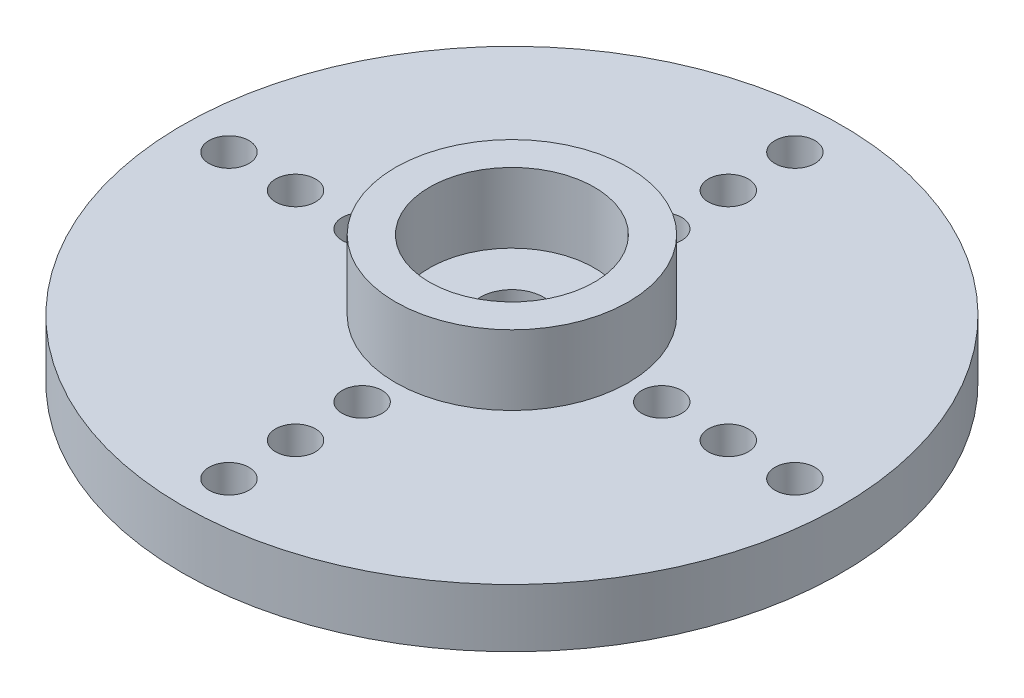
ISO-10303-21;
HEADER;
FILE_DESCRIPTION(('STEP AP214'),'2;1');
FILE_NAME('part.step','',(''),(''),'','','');
FILE_SCHEMA(('AUTOMOTIVE_DESIGN { 1 0 10303 214 1 1 1 1 }'));
ENDSEC;
DATA;
#1=APPLICATION_CONTEXT('core data for automotive mechanical design processes');
#2=APPLICATION_PROTOCOL_DEFINITION('international standard','automotive_design',2000,#1);
#3=PRODUCT_CONTEXT('',#1,'mechanical');
#4=PRODUCT('Part','Part','',(#3));
#5=PRODUCT_RELATED_PRODUCT_CATEGORY('part','',(#4));
#6=PRODUCT_DEFINITION_FORMATION('','',#4);
#7=PRODUCT_DEFINITION_CONTEXT('part definition',#1,'design');
#8=PRODUCT_DEFINITION('design','',#6,#7);
#9=PRODUCT_DEFINITION_SHAPE('','',#8);
#10=(LENGTH_UNIT() NAMED_UNIT(*) SI_UNIT(.MILLI.,.METRE.));
#11=(NAMED_UNIT(*) PLANE_ANGLE_UNIT() SI_UNIT($,.RADIAN.));
#12=(NAMED_UNIT(*) SI_UNIT($,.STERADIAN.) SOLID_ANGLE_UNIT());
#13=UNCERTAINTY_MEASURE_WITH_UNIT(LENGTH_MEASURE(1.E-05),#10,'distance_accuracy_value','');
#14=(GEOMETRIC_REPRESENTATION_CONTEXT(3) GLOBAL_UNCERTAINTY_ASSIGNED_CONTEXT((#13)) GLOBAL_UNIT_ASSIGNED_CONTEXT((#10,
#11,#12)) REPRESENTATION_CONTEXT('',''));
#15=CARTESIAN_POINT('',(0.,0.,0.));
#16=DIRECTION('',(0.,0.,1.));
#17=DIRECTION('',(1.,0.,0.));
#18=AXIS2_PLACEMENT_3D('',#15,#16,#17);
#19=CARTESIAN_POINT('',(0.,1.75,0.));
#20=DIRECTION('',(0.,-1.,0.));
#21=DIRECTION('',(0.,0.,-1.));
#22=AXIS2_PLACEMENT_3D('',#19,#20,#21);
#23=CYLINDRICAL_SURFACE('',#22,9.9);
#24=CARTESIAN_POINT('',(0.,1.75,0.));
#25=DIRECTION('',(0.,1.,0.));
#26=DIRECTION('',(0.,0.,1.));
#27=AXIS2_PLACEMENT_3D('',#24,#25,#26);
#28=CIRCLE('',#27,9.9);
#29=CARTESIAN_POINT('',(0.,1.75,9.9));
#30=VERTEX_POINT('',#29);
#31=EDGE_CURVE('E41',#30,#30,#28,.T.);
#32=ORIENTED_EDGE('',*,*,#31,.F.);
#33=EDGE_LOOP('',(#32));
#34=FACE_BOUND('',#33,.T.);
#35=CARTESIAN_POINT('',(0.,0.,0.));
#36=DIRECTION('',(0.,1.,0.));
#37=DIRECTION('',(0.,0.,1.));
#38=AXIS2_PLACEMENT_3D('',#35,#36,#37);
#39=CIRCLE('',#38,9.9);
#40=CARTESIAN_POINT('',(0.,0.,9.9));
#41=VERTEX_POINT('',#40);
#42=EDGE_CURVE('E44',#41,#41,#39,.T.);
#43=ORIENTED_EDGE('',*,*,#42,.T.);
#44=EDGE_LOOP('',(#43));
#45=FACE_BOUND('',#44,.T.);
#46=ADVANCED_FACE('F30',(#34,#45),#23,.T.);
#47=CARTESIAN_POINT('',(0.,1.75,0.));
#48=DIRECTION('',(0.,1.,0.));
#49=DIRECTION('',(0.,0.,1.));
#50=AXIS2_PLACEMENT_3D('',#47,#48,#49);
#51=PLANE('',#50);
#52=CARTESIAN_POINT('',(-6.5,1.75,0.));
#53=DIRECTION('',(0.,1.,0.));
#54=DIRECTION('',(-1.,0.,0.));
#55=AXIS2_PLACEMENT_3D('',#52,#53,#54);
#56=CIRCLE('',#55,0.6);
#57=CARTESIAN_POINT('',(-7.1,1.75,0.));
#58=VERTEX_POINT('',#57);
#59=EDGE_CURVE('E135',#58,#58,#56,.T.);
#60=ORIENTED_EDGE('',*,*,#59,.F.);
#61=EDGE_LOOP('',(#60));
#62=FACE_BOUND('',#61,.T.);
#63=CARTESIAN_POINT('',(0.,1.75,-6.5));
#64=DIRECTION('',(0.,1.,0.));
#65=DIRECTION('',(0.,0.,-1.));
#66=AXIS2_PLACEMENT_3D('',#63,#64,#65);
#67=CIRCLE('',#66,0.6);
#68=CARTESIAN_POINT('',(0.,1.75,-7.1));
#69=VERTEX_POINT('',#68);
#70=EDGE_CURVE('E128',#69,#69,#67,.T.);
#71=ORIENTED_EDGE('',*,*,#70,.F.);
#72=EDGE_LOOP('',(#71));
#73=FACE_BOUND('',#72,.T.);
#74=CARTESIAN_POINT('',(6.5,1.75,0.));
#75=DIRECTION('',(0.,1.,0.));
#76=DIRECTION('',(1.,0.,0.));
#77=AXIS2_PLACEMENT_3D('',#74,#75,#76);
#78=CIRCLE('',#77,0.6);
#79=CARTESIAN_POINT('',(7.1,1.75,0.));
#80=VERTEX_POINT('',#79);
#81=EDGE_CURVE('E129',#80,#80,#78,.T.);
#82=ORIENTED_EDGE('',*,*,#81,.F.);
#83=EDGE_LOOP('',(#82));
#84=FACE_BOUND('',#83,.T.);
#85=CARTESIAN_POINT('',(-8.5,1.75,0.));
#86=DIRECTION('',(0.,1.,0.));
#87=DIRECTION('',(-1.,0.,0.));
#88=AXIS2_PLACEMENT_3D('',#85,#86,#87);
#89=CIRCLE('',#88,0.6);
#90=CARTESIAN_POINT('',(-9.1,1.75,0.));
#91=VERTEX_POINT('',#90);
#92=EDGE_CURVE('E118',#91,#91,#89,.T.);
#93=ORIENTED_EDGE('',*,*,#92,.F.);
#94=EDGE_LOOP('',(#93));
#95=FACE_BOUND('',#94,.T.);
#96=CARTESIAN_POINT('',(0.,1.75,-8.5));
#97=DIRECTION('',(0.,1.,0.));
#98=DIRECTION('',(0.,0.,-1.));
#99=AXIS2_PLACEMENT_3D('',#96,#97,#98);
#100=CIRCLE('',#99,0.6);
#101=CARTESIAN_POINT('',(0.,1.75,-9.1));
#102=VERTEX_POINT('',#101);
#103=EDGE_CURVE('E110',#102,#102,#100,.T.);
#104=ORIENTED_EDGE('',*,*,#103,.F.);
#105=EDGE_LOOP('',(#104));
#106=FACE_BOUND('',#105,.T.);
#107=CARTESIAN_POINT('',(8.5,1.75,0.));
#108=DIRECTION('',(0.,1.,0.));
#109=DIRECTION('',(1.,0.,0.));
#110=AXIS2_PLACEMENT_3D('',#107,#108,#109);
#111=CIRCLE('',#110,0.6);
#112=CARTESIAN_POINT('',(9.1,1.75,0.));
#113=VERTEX_POINT('',#112);
#114=EDGE_CURVE('E111',#113,#113,#111,.T.);
#115=ORIENTED_EDGE('',*,*,#114,.F.);
#116=EDGE_LOOP('',(#115));
#117=FACE_BOUND('',#116,.T.);
#118=CARTESIAN_POINT('',(-4.5,1.75,0.));
#119=DIRECTION('',(0.,1.,0.));
#120=DIRECTION('',(-1.,0.,0.));
#121=AXIS2_PLACEMENT_3D('',#118,#119,#120);
#122=CIRCLE('',#121,0.6);
#123=CARTESIAN_POINT('',(-5.1,1.75,0.));
#124=VERTEX_POINT('',#123);
#125=EDGE_CURVE('E100',#124,#124,#122,.T.);
#126=ORIENTED_EDGE('',*,*,#125,.F.);
#127=EDGE_LOOP('',(#126));
#128=FACE_BOUND('',#127,.T.);
#129=CARTESIAN_POINT('',(0.,1.75,-4.5));
#130=DIRECTION('',(0.,1.,0.));
#131=DIRECTION('',(0.,0.,-1.));
#132=AXIS2_PLACEMENT_3D('',#129,#130,#131);
#133=CIRCLE('',#132,0.6);
#134=CARTESIAN_POINT('',(0.,1.75,-5.1));
#135=VERTEX_POINT('',#134);
#136=EDGE_CURVE('E92',#135,#135,#133,.T.);
#137=ORIENTED_EDGE('',*,*,#136,.F.);
#138=EDGE_LOOP('',(#137));
#139=FACE_BOUND('',#138,.T.);
#140=CARTESIAN_POINT('',(4.5,1.75,0.));
#141=DIRECTION('',(0.,1.,0.));
#142=DIRECTION('',(1.,0.,0.));
#143=AXIS2_PLACEMENT_3D('',#140,#141,#142);
#144=CIRCLE('',#143,0.6);
#145=CARTESIAN_POINT('',(5.1,1.75,0.));
#146=VERTEX_POINT('',#145);
#147=EDGE_CURVE('E93',#146,#146,#144,.T.);
#148=ORIENTED_EDGE('',*,*,#147,.F.);
#149=EDGE_LOOP('',(#148));
#150=FACE_BOUND('',#149,.T.);
#151=CARTESIAN_POINT('',(0.,1.75,4.5));
#152=DIRECTION('',(0.,1.,0.));
#153=DIRECTION('',(0.,0.,1.));
#154=AXIS2_PLACEMENT_3D('',#151,#152,#153);
#155=CIRCLE('',#154,0.6);
#156=CARTESIAN_POINT('',(0.,1.75,5.1));
#157=VERTEX_POINT('',#156);
#158=EDGE_CURVE('E70',#157,#157,#155,.T.);
#159=ORIENTED_EDGE('',*,*,#158,.F.);
#160=EDGE_LOOP('',(#159));
#161=FACE_BOUND('',#160,.T.);
#162=CARTESIAN_POINT('',(0.,1.75,6.5));
#163=DIRECTION('',(0.,1.,0.));
#164=DIRECTION('',(0.,0.,1.));
#165=AXIS2_PLACEMENT_3D('',#162,#163,#164);
#166=CIRCLE('',#165,0.6);
#167=CARTESIAN_POINT('',(0.,1.75,7.1));
#168=VERTEX_POINT('',#167);
#169=EDGE_CURVE('E73',#168,#168,#166,.T.);
#170=ORIENTED_EDGE('',*,*,#169,.F.);
#171=EDGE_LOOP('',(#170));
#172=FACE_BOUND('',#171,.T.);
#173=CARTESIAN_POINT('',(0.,1.75,8.5));
#174=DIRECTION('',(0.,1.,0.));
#175=DIRECTION('',(0.,0.,1.));
#176=AXIS2_PLACEMENT_3D('',#173,#174,#175);
#177=CIRCLE('',#176,0.6);
#178=CARTESIAN_POINT('',(0.,1.75,9.1));
#179=VERTEX_POINT('',#178);
#180=EDGE_CURVE('E76',#179,#179,#177,.T.);
#181=ORIENTED_EDGE('',*,*,#180,.F.);
#182=EDGE_LOOP('',(#181));
#183=FACE_BOUND('',#182,.T.);
#184=CARTESIAN_POINT('',(0.,1.75,0.));
#185=DIRECTION('',(0.,1.,0.));
#186=DIRECTION('',(0.,0.,1.));
#187=AXIS2_PLACEMENT_3D('',#184,#185,#186);
#188=CIRCLE('',#187,3.5);
#189=CARTESIAN_POINT('',(0.,1.75,3.5));
#190=VERTEX_POINT('',#189);
#191=EDGE_CURVE('E50',#190,#190,#188,.T.);
#192=ORIENTED_EDGE('',*,*,#191,.F.);
#193=EDGE_LOOP('',(#192));
#194=FACE_BOUND('',#193,.T.);
#195=ORIENTED_EDGE('',*,*,#31,.T.);
#196=EDGE_LOOP('',(#195));
#197=FACE_BOUND('',#196,.T.);
#198=ADVANCED_FACE('F146',(#62,#73,#84,#95,#106,#117,#128,#139,#150,#161,#172,#183,#194,#197),
#51,.T.);
#199=CARTESIAN_POINT('',(0.,0.,0.));
#200=DIRECTION('',(0.,1.,0.));
#201=DIRECTION('',(0.,0.,1.));
#202=AXIS2_PLACEMENT_3D('',#199,#200,#201);
#203=PLANE('',#202);
#204=CARTESIAN_POINT('',(-6.5,0.,0.));
#205=DIRECTION('',(0.,-1.,0.));
#206=DIRECTION('',(1.,0.,0.));
#207=AXIS2_PLACEMENT_3D('',#204,#205,#206);
#208=CIRCLE('',#207,0.6);
#209=CARTESIAN_POINT('',(-5.9,0.,0.));
#210=VERTEX_POINT('',#209);
#211=EDGE_CURVE('E114',#210,#210,#208,.T.);
#212=ORIENTED_EDGE('',*,*,#211,.F.);
#213=EDGE_LOOP('',(#212));
#214=FACE_BOUND('',#213,.T.);
#215=CARTESIAN_POINT('',(0.,0.,-6.5));
#216=DIRECTION('',(0.,-1.,0.));
#217=DIRECTION('',(0.,0.,1.));
#218=AXIS2_PLACEMENT_3D('',#215,#216,#217);
#219=CIRCLE('',#218,0.6);
#220=CARTESIAN_POINT('',(0.,0.,-5.9));
#221=VERTEX_POINT('',#220);
#222=EDGE_CURVE('E132',#221,#221,#219,.T.);
#223=ORIENTED_EDGE('',*,*,#222,.F.);
#224=EDGE_LOOP('',(#223));
#225=FACE_BOUND('',#224,.T.);
#226=CARTESIAN_POINT('',(6.5,0.,0.));
#227=DIRECTION('',(0.,-1.,0.));
#228=DIRECTION('',(-1.,0.,0.));
#229=AXIS2_PLACEMENT_3D('',#226,#227,#228);
#230=CIRCLE('',#229,0.6);
#231=CARTESIAN_POINT('',(5.9,0.,0.));
#232=VERTEX_POINT('',#231);
#233=EDGE_CURVE('E125',#232,#232,#230,.T.);
#234=ORIENTED_EDGE('',*,*,#233,.F.);
#235=EDGE_LOOP('',(#234));
#236=FACE_BOUND('',#235,.T.);
#237=CARTESIAN_POINT('',(-8.5,0.,0.));
#238=DIRECTION('',(0.,-1.,0.));
#239=DIRECTION('',(1.,0.,0.));
#240=AXIS2_PLACEMENT_3D('',#237,#238,#239);
#241=CIRCLE('',#240,0.6);
#242=CARTESIAN_POINT('',(-7.9,0.,0.));
#243=VERTEX_POINT('',#242);
#244=EDGE_CURVE('E96',#243,#243,#241,.T.);
#245=ORIENTED_EDGE('',*,*,#244,.F.);
#246=EDGE_LOOP('',(#245));
#247=FACE_BOUND('',#246,.T.);
#248=CARTESIAN_POINT('',(0.,0.,-8.5));
#249=DIRECTION('',(0.,-1.,0.));
#250=DIRECTION('',(0.,0.,1.));
#251=AXIS2_PLACEMENT_3D('',#248,#249,#250);
#252=CIRCLE('',#251,0.6);
#253=CARTESIAN_POINT('',(0.,0.,-7.9));
#254=VERTEX_POINT('',#253);
#255=EDGE_CURVE('E115',#254,#254,#252,.T.);
#256=ORIENTED_EDGE('',*,*,#255,.F.);
#257=EDGE_LOOP('',(#256));
#258=FACE_BOUND('',#257,.T.);
#259=CARTESIAN_POINT('',(8.5,0.,0.));
#260=DIRECTION('',(0.,-1.,0.));
#261=DIRECTION('',(-1.,0.,0.));
#262=AXIS2_PLACEMENT_3D('',#259,#260,#261);
#263=CIRCLE('',#262,0.6);
#264=CARTESIAN_POINT('',(7.9,0.,0.));
#265=VERTEX_POINT('',#264);
#266=EDGE_CURVE('E107',#265,#265,#263,.T.);
#267=ORIENTED_EDGE('',*,*,#266,.F.);
#268=EDGE_LOOP('',(#267));
#269=FACE_BOUND('',#268,.T.);
#270=CARTESIAN_POINT('',(-4.5,0.,0.));
#271=DIRECTION('',(0.,-1.,0.));
#272=DIRECTION('',(1.,0.,0.));
#273=AXIS2_PLACEMENT_3D('',#270,#271,#272);
#274=CIRCLE('',#273,0.6);
#275=CARTESIAN_POINT('',(-3.9,0.,0.));
#276=VERTEX_POINT('',#275);
#277=EDGE_CURVE('E84',#276,#276,#274,.T.);
#278=ORIENTED_EDGE('',*,*,#277,.F.);
#279=EDGE_LOOP('',(#278));
#280=FACE_BOUND('',#279,.T.);
#281=CARTESIAN_POINT('',(0.,0.,-4.5));
#282=DIRECTION('',(0.,-1.,0.));
#283=DIRECTION('',(0.,0.,1.));
#284=AXIS2_PLACEMENT_3D('',#281,#282,#283);
#285=CIRCLE('',#284,0.6);
#286=CARTESIAN_POINT('',(0.,0.,-3.9));
#287=VERTEX_POINT('',#286);
#288=EDGE_CURVE('E97',#287,#287,#285,.T.);
#289=ORIENTED_EDGE('',*,*,#288,.F.);
#290=EDGE_LOOP('',(#289));
#291=FACE_BOUND('',#290,.T.);
#292=CARTESIAN_POINT('',(4.5,0.,0.));
#293=DIRECTION('',(0.,-1.,0.));
#294=DIRECTION('',(-1.,0.,0.));
#295=AXIS2_PLACEMENT_3D('',#292,#293,#294);
#296=CIRCLE('',#295,0.6);
#297=CARTESIAN_POINT('',(3.9,0.,0.));
#298=VERTEX_POINT('',#297);
#299=EDGE_CURVE('E89',#298,#298,#296,.T.);
#300=ORIENTED_EDGE('',*,*,#299,.F.);
#301=EDGE_LOOP('',(#300));
#302=FACE_BOUND('',#301,.T.);
#303=CARTESIAN_POINT('',(0.,0.,4.5));
#304=DIRECTION('',(0.,-1.,0.));
#305=DIRECTION('',(0.,0.,-1.));
#306=AXIS2_PLACEMENT_3D('',#303,#304,#305);
#307=CIRCLE('',#306,0.6);
#308=CARTESIAN_POINT('',(0.,0.,3.9));
#309=VERTEX_POINT('',#308);
#310=EDGE_CURVE('E79',#309,#309,#307,.T.);
#311=ORIENTED_EDGE('',*,*,#310,.F.);
#312=EDGE_LOOP('',(#311));
#313=FACE_BOUND('',#312,.T.);
#314=CARTESIAN_POINT('',(0.,0.,6.5));
#315=DIRECTION('',(0.,-1.,0.));
#316=DIRECTION('',(0.,0.,-1.));
#317=AXIS2_PLACEMENT_3D('',#314,#315,#316);
#318=CIRCLE('',#317,0.6);
#319=CARTESIAN_POINT('',(0.,0.,5.9));
#320=VERTEX_POINT('',#319);
#321=EDGE_CURVE('E83',#320,#320,#318,.T.);
#322=ORIENTED_EDGE('',*,*,#321,.F.);
#323=EDGE_LOOP('',(#322));
#324=FACE_BOUND('',#323,.T.);
#325=CARTESIAN_POINT('',(0.,0.,8.5));
#326=DIRECTION('',(0.,-1.,0.));
#327=DIRECTION('',(0.,0.,-1.));
#328=AXIS2_PLACEMENT_3D('',#325,#326,#327);
#329=CIRCLE('',#328,0.6);
#330=CARTESIAN_POINT('',(0.,0.,7.9));
#331=VERTEX_POINT('',#330);
#332=EDGE_CURVE('E80',#331,#331,#329,.T.);
#333=ORIENTED_EDGE('',*,*,#332,.F.);
#334=EDGE_LOOP('',(#333));
#335=FACE_BOUND('',#334,.T.);
#336=CARTESIAN_POINT('',(0.,0.,0.));
#337=DIRECTION('',(0.,1.,0.));
#338=DIRECTION('',(0.,0.,1.));
#339=AXIS2_PLACEMENT_3D('',#336,#337,#338);
#340=CIRCLE('',#339,2.725);
#341=CARTESIAN_POINT('',(0.,0.,2.725));
#342=VERTEX_POINT('',#341);
#343=EDGE_CURVE('E10',#342,#342,#340,.F.);
#344=ORIENTED_EDGE('',*,*,#343,.F.);
#345=EDGE_LOOP('',(#344));
#346=FACE_BOUND('',#345,.T.);
#347=ORIENTED_EDGE('',*,*,#42,.F.);
#348=EDGE_LOOP('',(#347));
#349=FACE_BOUND('',#348,.T.);
#350=ADVANCED_FACE('F149',(#214,#225,#236,#247,#258,#269,#280,#291,#302,#313,#324,#335,#346,
#349),#203,.F.);
#351=CARTESIAN_POINT('',(0.,3.85,0.));
#352=DIRECTION('',(0.,1.,0.));
#353=DIRECTION('',(0.,0.,1.));
#354=AXIS2_PLACEMENT_3D('',#351,#352,#353);
#355=PLANE('',#354);
#356=CARTESIAN_POINT('',(0.,3.85,0.));
#357=DIRECTION('',(0.,1.,0.));
#358=DIRECTION('',(0.,0.,1.));
#359=AXIS2_PLACEMENT_3D('',#356,#357,#358);
#360=CIRCLE('',#359,3.5);
#361=CARTESIAN_POINT('',(0.,3.85,3.5));
#362=VERTEX_POINT('',#361);
#363=EDGE_CURVE('E47',#362,#362,#360,.T.);
#364=ORIENTED_EDGE('',*,*,#363,.T.);
#365=EDGE_LOOP('',(#364));
#366=FACE_BOUND('',#365,.T.);
#367=CARTESIAN_POINT('',(0.,3.85,0.));
#368=DIRECTION('',(0.,1.,0.));
#369=DIRECTION('',(0.,0.,1.));
#370=AXIS2_PLACEMENT_3D('',#367,#368,#369);
#371=CIRCLE('',#370,2.475);
#372=CARTESIAN_POINT('',(0.,3.85,2.475));
#373=VERTEX_POINT('',#372);
#374=EDGE_CURVE('E53',#373,#373,#371,.T.);
#375=ORIENTED_EDGE('',*,*,#374,.F.);
#376=EDGE_LOOP('',(#375));
#377=FACE_BOUND('',#376,.T.);
#378=ADVANCED_FACE('F183',(#366,#377),#355,.T.);
#379=CARTESIAN_POINT('',(0.,3.85,0.));
#380=DIRECTION('',(0.,-1.,0.));
#381=DIRECTION('',(0.,0.,-1.));
#382=AXIS2_PLACEMENT_3D('',#379,#380,#381);
#383=CYLINDRICAL_SURFACE('',#382,3.5);
#384=ORIENTED_EDGE('',*,*,#363,.F.);
#385=EDGE_LOOP('',(#384));
#386=FACE_BOUND('',#385,.T.);
#387=ORIENTED_EDGE('',*,*,#191,.T.);
#388=EDGE_LOOP('',(#387));
#389=FACE_BOUND('',#388,.T.);
#390=ADVANCED_FACE('F189',(#386,#389),#383,.T.);
#391=CARTESIAN_POINT('',(0.,3.85,0.));
#392=DIRECTION('',(0.,-1.,0.));
#393=DIRECTION('',(0.,0.,-1.));
#394=AXIS2_PLACEMENT_3D('',#391,#392,#393);
#395=CYLINDRICAL_SURFACE('',#394,2.475);
#396=ORIENTED_EDGE('',*,*,#374,.T.);
#397=EDGE_LOOP('',(#396));
#398=FACE_BOUND('',#397,.T.);
#399=CARTESIAN_POINT('',(0.,1.75,0.));
#400=DIRECTION('',(0.,1.,0.));
#401=DIRECTION('',(0.,0.,1.));
#402=AXIS2_PLACEMENT_3D('',#399,#400,#401);
#403=CIRCLE('',#402,2.475);
#404=CARTESIAN_POINT('',(0.,1.75,2.475));
#405=VERTEX_POINT('',#404);
#406=EDGE_CURVE('E37',#405,#405,#403,.F.);
#407=ORIENTED_EDGE('',*,*,#406,.T.);
#408=EDGE_LOOP('',(#407));
#409=FACE_BOUND('',#408,.T.);
#410=ADVANCED_FACE('F224',(#398,#409),#395,.F.);
#411=CARTESIAN_POINT('',(0.,1.75,0.));
#412=DIRECTION('',(0.,1.,0.));
#413=DIRECTION('',(0.,0.,1.));
#414=AXIS2_PLACEMENT_3D('',#411,#412,#413);
#415=CIRCLE('',#414,0.95);
#416=CARTESIAN_POINT('',(0.,1.75,-0.95));
#417=VERTEX_POINT('',#416);
#418=EDGE_CURVE('E33',#417,#417,#415,.T.);
#419=ORIENTED_EDGE('',*,*,#418,.F.);
#420=EDGE_LOOP('',(#419));
#421=FACE_BOUND('',#420,.T.);
#422=ORIENTED_EDGE('',*,*,#406,.F.);
#423=EDGE_LOOP('',(#422));
#424=FACE_BOUND('',#423,.T.);
#425=ADVANCED_FACE('F151',(#421,#424),#51,.T.);
#426=CARTESIAN_POINT('',(0.,-0.3,0.));
#427=DIRECTION('',(0.,-1.,0.));
#428=DIRECTION('',(0.,0.,-1.));
#429=AXIS2_PLACEMENT_3D('',#426,#427,#428);
#430=PLANE('',#429);
#431=CARTESIAN_POINT('',(0.,-0.3,0.));
#432=DIRECTION('',(0.,-1.,0.));
#433=DIRECTION('',(0.,0.,-1.));
#434=AXIS2_PLACEMENT_3D('',#431,#432,#433);
#435=CIRCLE('',#434,2.725);
#436=CARTESIAN_POINT('',(0.,-0.3,-2.725));
#437=VERTEX_POINT('',#436);
#438=EDGE_CURVE('E58',#437,#437,#435,.T.);
#439=ORIENTED_EDGE('',*,*,#438,.T.);
#440=EDGE_LOOP('',(#439));
#441=FACE_BOUND('',#440,.T.);
#442=CARTESIAN_POINT('',(0.,-0.3,0.));
#443=DIRECTION('',(0.,-1.,0.));
#444=DIRECTION('',(0.,0.,-1.));
#445=AXIS2_PLACEMENT_3D('',#442,#443,#444);
#446=CIRCLE('',#445,2.225);
#447=CARTESIAN_POINT('',(0.,-0.3,-2.225));
#448=VERTEX_POINT('',#447);
#449=EDGE_CURVE('E61',#448,#448,#446,.T.);
#450=ORIENTED_EDGE('',*,*,#449,.F.);
#451=EDGE_LOOP('',(#450));
#452=FACE_BOUND('',#451,.T.);
#453=ADVANCED_FACE('F216',(#441,#452),#430,.T.);
#454=CARTESIAN_POINT('',(0.,-0.3,0.));
#455=DIRECTION('',(0.,1.,0.));
#456=DIRECTION('',(0.,0.,1.));
#457=AXIS2_PLACEMENT_3D('',#454,#455,#456);
#458=CYLINDRICAL_SURFACE('',#457,2.725);
#459=ORIENTED_EDGE('',*,*,#438,.F.);
#460=EDGE_LOOP('',(#459));
#461=FACE_BOUND('',#460,.T.);
#462=ORIENTED_EDGE('',*,*,#343,.T.);
#463=EDGE_LOOP('',(#462));
#464=FACE_BOUND('',#463,.T.);
#465=ADVANCED_FACE('F205',(#461,#464),#458,.T.);
#466=CARTESIAN_POINT('',(0.,-0.3,0.));
#467=DIRECTION('',(0.,1.,0.));
#468=DIRECTION('',(0.,0.,1.));
#469=AXIS2_PLACEMENT_3D('',#466,#467,#468);
#470=CYLINDRICAL_SURFACE('',#469,2.225);
#471=ORIENTED_EDGE('',*,*,#449,.T.);
#472=EDGE_LOOP('',(#471));
#473=FACE_BOUND('',#472,.T.);
#474=CARTESIAN_POINT('',(0.,0.,0.));
#475=DIRECTION('',(0.,-1.,0.));
#476=DIRECTION('',(0.,0.,-1.));
#477=AXIS2_PLACEMENT_3D('',#474,#475,#476);
#478=CIRCLE('',#477,2.225);
#479=CARTESIAN_POINT('',(0.,0.,-2.225));
#480=VERTEX_POINT('',#479);
#481=EDGE_CURVE('E62',#480,#480,#478,.T.);
#482=ORIENTED_EDGE('',*,*,#481,.F.);
#483=EDGE_LOOP('',(#482));
#484=FACE_BOUND('',#483,.T.);
#485=ADVANCED_FACE('F196',(#473,#484),#470,.F.);
#486=CARTESIAN_POINT('',(0.,0.,0.));
#487=DIRECTION('',(0.,-1.,0.));
#488=DIRECTION('',(0.,0.,-1.));
#489=AXIS2_PLACEMENT_3D('',#486,#487,#488);
#490=CIRCLE('',#489,0.95);
#491=CARTESIAN_POINT('',(0.,0.,-0.95));
#492=VERTEX_POINT('',#491);
#493=EDGE_CURVE('E67',#492,#492,#490,.T.);
#494=ORIENTED_EDGE('',*,*,#493,.F.);
#495=EDGE_LOOP('',(#494));
#496=FACE_BOUND('',#495,.T.);
#497=ORIENTED_EDGE('',*,*,#481,.T.);
#498=EDGE_LOOP('',(#497));
#499=FACE_BOUND('',#498,.T.);
#500=ADVANCED_FACE('F185',(#496,#499),#203,.F.);
#501=CARTESIAN_POINT('',(0.,3.85,0.));
#502=DIRECTION('',(0.,-1.,0.));
#503=DIRECTION('',(0.,0.,-1.));
#504=AXIS2_PLACEMENT_3D('',#501,#502,#503);
#505=CYLINDRICAL_SURFACE('',#504,0.95);
#506=CARTESIAN_POINT('',(0.,1.75,-0.95));
#507=CARTESIAN_POINT('',(0.,1.73177083333333,-0.95));
#508=CARTESIAN_POINT('',(0.,1.71354166666667,-0.95));
#509=CARTESIAN_POINT('',(0.,1.67708333333333,-0.95));
#510=CARTESIAN_POINT('',(0.,1.65885416666667,-0.95));
#511=CARTESIAN_POINT('',(0.,1.62239583333333,-0.95));
#512=CARTESIAN_POINT('',(0.,1.60416666666667,-0.95));
#513=CARTESIAN_POINT('',(0.,1.56770833333333,-0.95));
#514=CARTESIAN_POINT('',(0.,1.54947916666667,-0.95));
#515=CARTESIAN_POINT('',(0.,1.51302083333333,-0.95));
#516=CARTESIAN_POINT('',(0.,1.49479166666667,-0.95));
#517=CARTESIAN_POINT('',(0.,1.45833333333333,-0.95));
#518=CARTESIAN_POINT('',(0.,1.44010416666667,-0.95));
#519=CARTESIAN_POINT('',(0.,1.40364583333333,-0.95));
#520=CARTESIAN_POINT('',(0.,1.38541666666667,-0.95));
#521=CARTESIAN_POINT('',(0.,1.34895833333333,-0.95));
#522=CARTESIAN_POINT('',(0.,1.33072916666667,-0.95));
#523=CARTESIAN_POINT('',(0.,1.29427083333333,-0.95));
#524=CARTESIAN_POINT('',(0.,1.27604166666667,-0.95));
#525=CARTESIAN_POINT('',(0.,1.23958333333333,-0.95));
#526=CARTESIAN_POINT('',(0.,1.22135416666667,-0.95));
#527=CARTESIAN_POINT('',(0.,1.18489583333333,-0.95));
#528=CARTESIAN_POINT('',(0.,1.16666666666667,-0.95));
#529=CARTESIAN_POINT('',(0.,1.13020833333333,-0.95));
#530=CARTESIAN_POINT('',(0.,1.11197916666667,-0.95));
#531=CARTESIAN_POINT('',(0.,1.07552083333333,-0.95));
#532=CARTESIAN_POINT('',(0.,1.05729166666667,-0.95));
#533=CARTESIAN_POINT('',(0.,1.02083333333333,-0.95));
#534=CARTESIAN_POINT('',(0.,1.00260416666667,-0.95));
#535=CARTESIAN_POINT('',(0.,0.966145833333333,-0.95));
#536=CARTESIAN_POINT('',(0.,0.947916666666666,-0.95));
#537=CARTESIAN_POINT('',(0.,0.911458333333333,-0.95));
#538=CARTESIAN_POINT('',(0.,0.893229166666667,-0.95));
#539=CARTESIAN_POINT('',(0.,0.856770833333333,-0.95));
#540=CARTESIAN_POINT('',(0.,0.838541666666667,-0.95));
#541=CARTESIAN_POINT('',(0.,0.802083333333333,-0.95));
#542=CARTESIAN_POINT('',(0.,0.783854166666667,-0.95));
#543=CARTESIAN_POINT('',(0.,0.747395833333333,-0.95));
#544=CARTESIAN_POINT('',(0.,0.729166666666667,-0.95));
#545=CARTESIAN_POINT('',(0.,0.692708333333333,-0.95));
#546=CARTESIAN_POINT('',(0.,0.674479166666667,-0.95));
#547=CARTESIAN_POINT('',(0.,0.638020833333333,-0.95));
#548=CARTESIAN_POINT('',(0.,0.619791666666667,-0.95));
#549=CARTESIAN_POINT('',(0.,0.583333333333333,-0.95));
#550=CARTESIAN_POINT('',(0.,0.565104166666667,-0.95));
#551=CARTESIAN_POINT('',(0.,0.528645833333333,-0.95));
#552=CARTESIAN_POINT('',(0.,0.510416666666667,-0.95));
#553=CARTESIAN_POINT('',(0.,0.473958333333333,-0.95));
#554=CARTESIAN_POINT('',(0.,0.455729166666667,-0.95));
#555=CARTESIAN_POINT('',(0.,0.419270833333333,-0.95));
#556=CARTESIAN_POINT('',(0.,0.401041666666667,-0.95));
#557=CARTESIAN_POINT('',(0.,0.364583333333333,-0.95));
#558=CARTESIAN_POINT('',(0.,0.346354166666667,-0.95));
#559=CARTESIAN_POINT('',(0.,0.309895833333334,-0.95));
#560=CARTESIAN_POINT('',(0.,0.291666666666667,-0.95));
#561=CARTESIAN_POINT('',(0.,0.255208333333334,-0.95));
#562=CARTESIAN_POINT('',(0.,0.236979166666667,-0.95));
#563=CARTESIAN_POINT('',(0.,0.200520833333334,-0.95));
#564=CARTESIAN_POINT('',(0.,0.182291666666667,-0.95));
#565=CARTESIAN_POINT('',(0.,0.145833333333334,-0.95));
#566=CARTESIAN_POINT('',(0.,0.127604166666667,-0.95));
#567=CARTESIAN_POINT('',(0.,0.0911458333333339,-0.95));
#568=CARTESIAN_POINT('',(0.,0.0729166666666672,-0.95));
#569=CARTESIAN_POINT('',(0.,0.0364583333333338,-0.95));
#570=CARTESIAN_POINT('',(0.,0.0182291666666671,-0.95));
#571=CARTESIAN_POINT('',(0.,0.,-0.95));
#572=B_SPLINE_CURVE_WITH_KNOTS('',3,(#506,#507,#508,#509,#510,#511,#512,#513,#514,#515,#516,
#517,#518,#519,#520,#521,#522,#523,#524,#525,#526,#527,#528,#529,#530,#531,#532,#533,#534,#535,
#536,#537,#538,#539,#540,#541,#542,#543,#544,#545,#546,#547,#548,#549,#550,#551,#552,#553,#554,
#555,#556,#557,#558,#559,#560,#561,#562,#563,#564,#565,#566,#567,#568,#569,#570,#571),
.UNSPECIFIED.,.F.,.F.,(4,2,2,2,2,2,2,2,2,2,2,2,2,2,2,2,2,2,2,2,2,2,2,2,2,2,2,2,2,2,2,2,4),(0.,
0.0546875,0.109375,0.1640625,0.21875,0.2734375,0.328125,0.3828125,0.4375,0.4921875,0.546875,
0.6015625,0.65625,0.7109375,0.765625,0.820312499999999,0.874999999999999,0.9296875,
0.984374999999999,1.0390625,1.09375,1.1484375,1.203125,1.2578125,1.3125,1.3671875,1.421875,
1.4765625,1.53125,1.5859375,1.640625,1.6953125,1.75),.UNSPECIFIED.);
#573=EDGE_CURVE('BSEAM195',#417,#492,#572,.T.);
#574=ORIENTED_EDGE('',*,*,#418,.T.);
#575=ORIENTED_EDGE('',*,*,#493,.T.);
#576=ORIENTED_EDGE('',*,*,#573,.T.);
#577=ORIENTED_EDGE('',*,*,#573,.F.);
#578=EDGE_LOOP('',(#574,#576,#575,#577));
#579=FACE_BOUND('',#578,.T.);
#580=ADVANCED_FACE('F195',(#579),#505,.F.);
#581=CARTESIAN_POINT('',(0.,3.85,8.5));
#582=DIRECTION('',(0.,-1.,0.));
#583=DIRECTION('',(0.,0.,-1.));
#584=AXIS2_PLACEMENT_3D('',#581,#582,#583);
#585=CYLINDRICAL_SURFACE('',#584,0.6);
#586=ORIENTED_EDGE('',*,*,#180,.T.);
#587=EDGE_LOOP('',(#586));
#588=FACE_BOUND('',#587,.T.);
#589=ORIENTED_EDGE('',*,*,#332,.T.);
#590=EDGE_LOOP('',(#589));
#591=FACE_BOUND('',#590,.T.);
#592=ADVANCED_FACE('F202',(#588,#591),#585,.F.);
#593=CARTESIAN_POINT('',(0.,3.85,6.5));
#594=DIRECTION('',(0.,-1.,0.));
#595=DIRECTION('',(0.,0.,-1.));
#596=AXIS2_PLACEMENT_3D('',#593,#594,#595);
#597=CYLINDRICAL_SURFACE('',#596,0.6);
#598=ORIENTED_EDGE('',*,*,#169,.T.);
#599=EDGE_LOOP('',(#598));
#600=FACE_BOUND('',#599,.T.);
#601=ORIENTED_EDGE('',*,*,#321,.T.);
#602=EDGE_LOOP('',(#601));
#603=FACE_BOUND('',#602,.T.);
#604=ADVANCED_FACE('F274',(#600,#603),#597,.F.);
#605=CARTESIAN_POINT('',(0.,3.85,4.5));
#606=DIRECTION('',(0.,-1.,0.));
#607=DIRECTION('',(0.,0.,-1.));
#608=AXIS2_PLACEMENT_3D('',#605,#606,#607);
#609=CYLINDRICAL_SURFACE('',#608,0.6);
#610=ORIENTED_EDGE('',*,*,#158,.T.);
#611=EDGE_LOOP('',(#610));
#612=FACE_BOUND('',#611,.T.);
#613=ORIENTED_EDGE('',*,*,#310,.T.);
#614=EDGE_LOOP('',(#613));
#615=FACE_BOUND('',#614,.T.);
#616=ADVANCED_FACE('F282',(#612,#615),#609,.F.);
#617=CARTESIAN_POINT('',(4.5,3.85,0.));
#618=DIRECTION('',(0.,-1.,0.));
#619=DIRECTION('',(-1.,0.,0.));
#620=AXIS2_PLACEMENT_3D('',#617,#618,#619);
#621=CYLINDRICAL_SURFACE('',#620,0.6);
#622=ORIENTED_EDGE('',*,*,#147,.T.);
#623=EDGE_LOOP('',(#622));
#624=FACE_BOUND('',#623,.T.);
#625=ORIENTED_EDGE('',*,*,#299,.T.);
#626=EDGE_LOOP('',(#625));
#627=FACE_BOUND('',#626,.T.);
#628=ADVANCED_FACE('F291',(#624,#627),#621,.F.);
#629=CARTESIAN_POINT('',(0.,3.85,-4.5));
#630=DIRECTION('',(0.,-1.,0.));
#631=DIRECTION('',(0.,0.,1.));
#632=AXIS2_PLACEMENT_3D('',#629,#630,#631);
#633=CYLINDRICAL_SURFACE('',#632,0.6);
#634=ORIENTED_EDGE('',*,*,#136,.T.);
#635=EDGE_LOOP('',(#634));
#636=FACE_BOUND('',#635,.T.);
#637=ORIENTED_EDGE('',*,*,#288,.T.);
#638=EDGE_LOOP('',(#637));
#639=FACE_BOUND('',#638,.T.);
#640=ADVANCED_FACE('F301',(#636,#639),#633,.F.);
#641=CARTESIAN_POINT('',(-4.5,3.85,0.));
#642=DIRECTION('',(0.,-1.,0.));
#643=DIRECTION('',(1.,0.,0.));
#644=AXIS2_PLACEMENT_3D('',#641,#642,#643);
#645=CYLINDRICAL_SURFACE('',#644,0.6);
#646=ORIENTED_EDGE('',*,*,#125,.T.);
#647=EDGE_LOOP('',(#646));
#648=FACE_BOUND('',#647,.T.);
#649=ORIENTED_EDGE('',*,*,#277,.T.);
#650=EDGE_LOOP('',(#649));
#651=FACE_BOUND('',#650,.T.);
#652=ADVANCED_FACE('F310',(#648,#651),#645,.F.);
#653=CARTESIAN_POINT('',(8.5,3.85,0.));
#654=DIRECTION('',(0.,-1.,0.));
#655=DIRECTION('',(-1.,0.,0.));
#656=AXIS2_PLACEMENT_3D('',#653,#654,#655);
#657=CYLINDRICAL_SURFACE('',#656,0.6);
#658=ORIENTED_EDGE('',*,*,#114,.T.);
#659=EDGE_LOOP('',(#658));
#660=FACE_BOUND('',#659,.T.);
#661=ORIENTED_EDGE('',*,*,#266,.T.);
#662=EDGE_LOOP('',(#661));
#663=FACE_BOUND('',#662,.T.);
#664=ADVANCED_FACE('F319',(#660,#663),#657,.F.);
#665=CARTESIAN_POINT('',(0.,3.85,-8.5));
#666=DIRECTION('',(0.,-1.,0.));
#667=DIRECTION('',(0.,0.,1.));
#668=AXIS2_PLACEMENT_3D('',#665,#666,#667);
#669=CYLINDRICAL_SURFACE('',#668,0.6);
#670=ORIENTED_EDGE('',*,*,#103,.T.);
#671=EDGE_LOOP('',(#670));
#672=FACE_BOUND('',#671,.T.);
#673=ORIENTED_EDGE('',*,*,#255,.T.);
#674=EDGE_LOOP('',(#673));
#675=FACE_BOUND('',#674,.T.);
#676=ADVANCED_FACE('F328',(#672,#675),#669,.F.);
#677=CARTESIAN_POINT('',(-8.5,3.85,0.));
#678=DIRECTION('',(0.,-1.,0.));
#679=DIRECTION('',(1.,0.,0.));
#680=AXIS2_PLACEMENT_3D('',#677,#678,#679);
#681=CYLINDRICAL_SURFACE('',#680,0.6);
#682=ORIENTED_EDGE('',*,*,#92,.T.);
#683=EDGE_LOOP('',(#682));
#684=FACE_BOUND('',#683,.T.);
#685=ORIENTED_EDGE('',*,*,#244,.T.);
#686=EDGE_LOOP('',(#685));
#687=FACE_BOUND('',#686,.T.);
#688=ADVANCED_FACE('F337',(#684,#687),#681,.F.);
#689=CARTESIAN_POINT('',(6.5,3.85,0.));
#690=DIRECTION('',(0.,-1.,0.));
#691=DIRECTION('',(-1.,0.,0.));
#692=AXIS2_PLACEMENT_3D('',#689,#690,#691);
#693=CYLINDRICAL_SURFACE('',#692,0.6);
#694=ORIENTED_EDGE('',*,*,#81,.T.);
#695=EDGE_LOOP('',(#694));
#696=FACE_BOUND('',#695,.T.);
#697=ORIENTED_EDGE('',*,*,#233,.T.);
#698=EDGE_LOOP('',(#697));
#699=FACE_BOUND('',#698,.T.);
#700=ADVANCED_FACE('F346',(#696,#699),#693,.F.);
#701=CARTESIAN_POINT('',(0.,3.85,-6.5));
#702=DIRECTION('',(0.,-1.,0.));
#703=DIRECTION('',(0.,0.,1.));
#704=AXIS2_PLACEMENT_3D('',#701,#702,#703);
#705=CYLINDRICAL_SURFACE('',#704,0.6);
#706=ORIENTED_EDGE('',*,*,#70,.T.);
#707=EDGE_LOOP('',(#706));
#708=FACE_BOUND('',#707,.T.);
#709=ORIENTED_EDGE('',*,*,#222,.T.);
#710=EDGE_LOOP('',(#709));
#711=FACE_BOUND('',#710,.T.);
#712=ADVANCED_FACE('F355',(#708,#711),#705,.F.);
#713=CARTESIAN_POINT('',(-6.5,3.85,0.));
#714=DIRECTION('',(0.,-1.,0.));
#715=DIRECTION('',(1.,0.,0.));
#716=AXIS2_PLACEMENT_3D('',#713,#714,#715);
#717=CYLINDRICAL_SURFACE('',#716,0.6);
#718=ORIENTED_EDGE('',*,*,#59,.T.);
#719=EDGE_LOOP('',(#718));
#720=FACE_BOUND('',#719,.T.);
#721=ORIENTED_EDGE('',*,*,#211,.T.);
#722=EDGE_LOOP('',(#721));
#723=FACE_BOUND('',#722,.T.);
#724=ADVANCED_FACE('F143',(#720,#723),#717,.F.);
#725=CLOSED_SHELL('',(#46,#198,#350,#378,#390,#410,#425,#453,#465,#485,#500,#580,#592,#604,#616,
#628,#640,#652,#664,#676,#688,#700,#712,#724));
#726=MANIFOLD_SOLID_BREP('B2',#725);
#727=ADVANCED_BREP_SHAPE_REPRESENTATION('',(#18,#726),#14);
#728=SHAPE_DEFINITION_REPRESENTATION(#9,#727);
ENDSEC;
END-ISO-10303-21;
